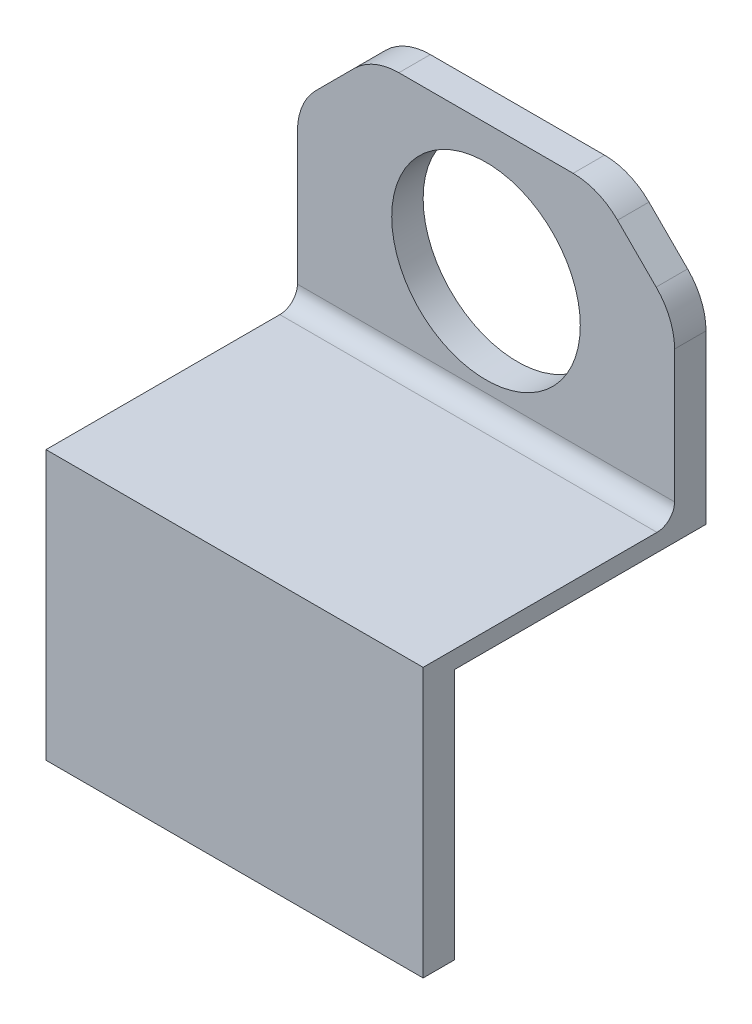
ISO-10303-21;
HEADER;
FILE_DESCRIPTION(('STEP AP214'),'2;1');
FILE_NAME('part.step','',(''),(''),'','','');
FILE_SCHEMA(('AUTOMOTIVE_DESIGN { 1 0 10303 214 1 1 1 1 }'));
ENDSEC;
DATA;
#1=APPLICATION_CONTEXT('core data for automotive mechanical design processes');
#2=APPLICATION_PROTOCOL_DEFINITION('international standard','automotive_design',2000,#1);
#3=PRODUCT_CONTEXT('',#1,'mechanical');
#4=PRODUCT('Part','Part','',(#3));
#5=PRODUCT_RELATED_PRODUCT_CATEGORY('part','',(#4));
#6=PRODUCT_DEFINITION_FORMATION('','',#4);
#7=PRODUCT_DEFINITION_CONTEXT('part definition',#1,'design');
#8=PRODUCT_DEFINITION('design','',#6,#7);
#9=PRODUCT_DEFINITION_SHAPE('','',#8);
#10=(LENGTH_UNIT() NAMED_UNIT(*) SI_UNIT(.MILLI.,.METRE.));
#11=(NAMED_UNIT(*) PLANE_ANGLE_UNIT() SI_UNIT($,.RADIAN.));
#12=(NAMED_UNIT(*) SI_UNIT($,.STERADIAN.) SOLID_ANGLE_UNIT());
#13=UNCERTAINTY_MEASURE_WITH_UNIT(LENGTH_MEASURE(1.E-05),#10,'distance_accuracy_value','');
#14=(GEOMETRIC_REPRESENTATION_CONTEXT(3) GLOBAL_UNCERTAINTY_ASSIGNED_CONTEXT((#13)) GLOBAL_UNIT_ASSIGNED_CONTEXT((#10,
#11,#12)) REPRESENTATION_CONTEXT('',''));
#15=CARTESIAN_POINT('',(0.,0.,0.));
#16=DIRECTION('',(0.,0.,1.));
#17=DIRECTION('',(1.,0.,0.));
#18=AXIS2_PLACEMENT_3D('',#15,#16,#17);
#19=CARTESIAN_POINT('',(0.,14.478,0.));
#20=DIRECTION('',(0.,-1.,0.));
#21=DIRECTION('',(0.,0.,-1.));
#22=AXIS2_PLACEMENT_3D('',#19,#20,#21);
#23=PLANE('',#22);
#24=DIRECTION('',(0.,0.,-1.));
#25=VECTOR('',#24,1.);
#26=CARTESIAN_POINT('',(19.05,14.478,1.5875));
#27=LINE('',#26,#25);
#28=CARTESIAN_POINT('',(19.05,14.478,1.5875));
#29=VERTEX_POINT('',#28);
#30=CARTESIAN_POINT('',(19.05,14.478,-22.0345));
#31=VERTEX_POINT('',#30);
#32=EDGE_CURVE('E160',#29,#31,#27,.T.);
#33=ORIENTED_EDGE('',*,*,#32,.T.);
#34=DIRECTION('',(1.,0.,0.));
#35=VECTOR('',#34,1.);
#36=CARTESIAN_POINT('',(-19.05,14.478,-22.0345));
#37=LINE('',#36,#35);
#38=CARTESIAN_POINT('',(-19.05,14.478,-22.0345));
#39=VERTEX_POINT('',#38);
#40=EDGE_CURVE('E56',#31,#39,#37,.F.);
#41=ORIENTED_EDGE('',*,*,#40,.T.);
#42=DIRECTION('',(0.,0.,1.));
#43=VECTOR('',#42,1.);
#44=CARTESIAN_POINT('',(-19.05,14.478,1.5875));
#45=LINE('',#44,#43);
#46=CARTESIAN_POINT('',(-19.05,14.478,1.5875));
#47=VERTEX_POINT('',#46);
#48=EDGE_CURVE('E139',#39,#47,#45,.T.);
#49=ORIENTED_EDGE('',*,*,#48,.T.);
#50=DIRECTION('',(1.,0.,0.));
#51=VECTOR('',#50,1.);
#52=CARTESIAN_POINT('',(-19.05,14.478,1.5875));
#53=LINE('',#52,#51);
#54=EDGE_CURVE('E142',#47,#29,#53,.T.);
#55=ORIENTED_EDGE('',*,*,#54,.T.);
#56=EDGE_LOOP('',(#33,#41,#49,#55));
#57=FACE_BOUND('',#56,.T.);
#58=ADVANCED_FACE('F35',(#57),#23,.F.);
#59=CARTESIAN_POINT('',(19.05,12.7,1.5875));
#60=DIRECTION('',(-1.,0.,0.));
#61=DIRECTION('',(0.,0.,1.));
#62=AXIS2_PLACEMENT_3D('',#59,#60,#61);
#63=PLANE('',#62);
#64=DIRECTION('',(0.,-1.,0.));
#65=VECTOR('',#64,1.);
#66=CARTESIAN_POINT('',(19.05,14.478,-26.9875));
#67=LINE('',#66,#65);
#68=CARTESIAN_POINT('',(19.05,29.6277438789308,-26.9875));
#69=VERTEX_POINT('',#68);
#70=CARTESIAN_POINT('',(19.05,12.7,-26.9875));
#71=VERTEX_POINT('',#70);
#72=EDGE_CURVE('E222',#69,#71,#67,.T.);
#73=ORIENTED_EDGE('',*,*,#72,.F.);
#74=DIRECTION('',(0.,0.,-1.));
#75=VECTOR('',#74,1.);
#76=CARTESIAN_POINT('',(19.05,29.6277438789308,-23.8125));
#77=LINE('',#76,#75);
#78=CARTESIAN_POINT('',(19.05,29.6277438789308,-23.8125));
#79=VERTEX_POINT('',#78);
#80=EDGE_CURVE('E202',#69,#79,#77,.F.);
#81=ORIENTED_EDGE('',*,*,#80,.T.);
#82=DIRECTION('',(0.,-1.,0.));
#83=VECTOR('',#82,1.);
#84=CARTESIAN_POINT('',(19.05,39.878,-23.8125));
#85=LINE('',#84,#83);
#86=CARTESIAN_POINT('',(19.05,16.256,-23.8125));
#87=VERTEX_POINT('',#86);
#88=EDGE_CURVE('E181',#79,#87,#85,.T.);
#89=ORIENTED_EDGE('',*,*,#88,.T.);
#90=CARTESIAN_POINT('',(19.05,16.256,-22.0345));
#91=DIRECTION('',(-1.,0.,0.));
#92=DIRECTION('',(0.,0.,1.));
#93=AXIS2_PLACEMENT_3D('',#90,#91,#92);
#94=CIRCLE('',#93,1.778);
#95=EDGE_CURVE('E43',#87,#31,#94,.T.);
#96=ORIENTED_EDGE('',*,*,#95,.T.);
#97=ORIENTED_EDGE('',*,*,#32,.F.);
#98=DIRECTION('',(0.,1.,0.));
#99=VECTOR('',#98,1.);
#100=CARTESIAN_POINT('',(19.05,12.7,1.5875));
#101=LINE('',#100,#99);
#102=CARTESIAN_POINT('',(19.05,-12.7,1.5875));
#103=VERTEX_POINT('',#102);
#104=EDGE_CURVE('E156',#103,#29,#101,.T.);
#105=ORIENTED_EDGE('',*,*,#104,.F.);
#106=DIRECTION('',(0.,0.,-1.));
#107=VECTOR('',#106,1.);
#108=CARTESIAN_POINT('',(19.05,-12.7,1.5875));
#109=LINE('',#108,#107);
#110=CARTESIAN_POINT('',(19.05,-12.7,-1.5875));
#111=VERTEX_POINT('',#110);
#112=EDGE_CURVE('E241',#103,#111,#109,.T.);
#113=ORIENTED_EDGE('',*,*,#112,.T.);
#114=DIRECTION('',(0.,1.,0.));
#115=VECTOR('',#114,1.);
#116=CARTESIAN_POINT('',(19.05,12.7,-1.5875));
#117=LINE('',#116,#115);
#118=CARTESIAN_POINT('',(19.05,12.7,-1.5875));
#119=VERTEX_POINT('',#118);
#120=EDGE_CURVE('E279',#111,#119,#117,.T.);
#121=ORIENTED_EDGE('',*,*,#120,.T.);
#122=DIRECTION('',(0.,0.,-1.));
#123=VECTOR('',#122,1.);
#124=CARTESIAN_POINT('',(19.05,12.7,1.5875));
#125=LINE('',#124,#123);
#126=EDGE_CURVE('E284',#119,#71,#125,.T.);
#127=ORIENTED_EDGE('',*,*,#126,.T.);
#128=EDGE_LOOP('',(#73,#81,#89,#96,#97,#105,#113,#121,#127));
#129=FACE_BOUND('',#128,.T.);
#130=ADVANCED_FACE('F219',(#129),#63,.F.);
#131=CARTESIAN_POINT('',(-19.05,12.7,1.5875));
#132=DIRECTION('',(1.,0.,0.));
#133=DIRECTION('',(0.,0.,-1.));
#134=AXIS2_PLACEMENT_3D('',#131,#132,#133);
#135=PLANE('',#134);
#136=DIRECTION('',(0.,-1.,0.));
#137=VECTOR('',#136,1.);
#138=CARTESIAN_POINT('',(-19.05,39.878,-23.8125));
#139=LINE('',#138,#137);
#140=CARTESIAN_POINT('',(-19.05,29.6277438789308,-23.8125));
#141=VERTEX_POINT('',#140);
#142=CARTESIAN_POINT('',(-19.05,16.256,-23.8125));
#143=VERTEX_POINT('',#142);
#144=EDGE_CURVE('E184',#141,#143,#139,.T.);
#145=ORIENTED_EDGE('',*,*,#144,.F.);
#146=DIRECTION('',(0.,0.,1.));
#147=VECTOR('',#146,1.);
#148=CARTESIAN_POINT('',(-19.05,29.6277438789308,-26.9875));
#149=LINE('',#148,#147);
#150=CARTESIAN_POINT('',(-19.05,29.6277438789308,-26.9875));
#151=VERTEX_POINT('',#150);
#152=EDGE_CURVE('E248',#141,#151,#149,.F.);
#153=ORIENTED_EDGE('',*,*,#152,.T.);
#154=DIRECTION('',(0.,-1.,0.));
#155=VECTOR('',#154,1.);
#156=CARTESIAN_POINT('',(-19.05,14.478,-26.9875));
#157=LINE('',#156,#155);
#158=CARTESIAN_POINT('',(-19.05,12.7,-26.9875));
#159=VERTEX_POINT('',#158);
#160=EDGE_CURVE('E162',#151,#159,#157,.T.);
#161=ORIENTED_EDGE('',*,*,#160,.T.);
#162=DIRECTION('',(0.,0.,1.));
#163=VECTOR('',#162,1.);
#164=CARTESIAN_POINT('',(-19.05,12.7,1.5875));
#165=LINE('',#164,#163);
#166=CARTESIAN_POINT('',(-19.05,12.7,-1.5875));
#167=VERTEX_POINT('',#166);
#168=EDGE_CURVE('E250',#159,#167,#165,.T.);
#169=ORIENTED_EDGE('',*,*,#168,.T.);
#170=DIRECTION('',(0.,-1.,0.));
#171=VECTOR('',#170,1.);
#172=CARTESIAN_POINT('',(-19.05,12.7,-1.5875));
#173=LINE('',#172,#171);
#174=CARTESIAN_POINT('',(-19.05,-12.7,-1.5875));
#175=VERTEX_POINT('',#174);
#176=EDGE_CURVE('E297',#167,#175,#173,.T.);
#177=ORIENTED_EDGE('',*,*,#176,.T.);
#178=DIRECTION('',(0.,0.,-1.));
#179=VECTOR('',#178,1.);
#180=CARTESIAN_POINT('',(-19.05,-12.7,1.5875));
#181=LINE('',#180,#179);
#182=CARTESIAN_POINT('',(-19.05,-12.7,1.5875));
#183=VERTEX_POINT('',#182);
#184=EDGE_CURVE('E152',#183,#175,#181,.T.);
#185=ORIENTED_EDGE('',*,*,#184,.F.);
#186=DIRECTION('',(0.,-1.,0.));
#187=VECTOR('',#186,1.);
#188=CARTESIAN_POINT('',(-19.05,12.7,1.5875));
#189=LINE('',#188,#187);
#190=EDGE_CURVE('E148',#47,#183,#189,.T.);
#191=ORIENTED_EDGE('',*,*,#190,.F.);
#192=ORIENTED_EDGE('',*,*,#48,.F.);
#193=CARTESIAN_POINT('',(-19.05,16.256,-22.0345));
#194=DIRECTION('',(1.,0.,0.));
#195=DIRECTION('',(0.,0.,-1.));
#196=AXIS2_PLACEMENT_3D('',#193,#194,#195);
#197=CIRCLE('',#196,1.778);
#198=EDGE_CURVE('E11',#39,#143,#197,.T.);
#199=ORIENTED_EDGE('',*,*,#198,.T.);
#200=EDGE_LOOP('',(#145,#153,#161,#169,#177,#185,#191,#192,#199));
#201=FACE_BOUND('',#200,.T.);
#202=ADVANCED_FACE('F150',(#201),#135,.F.);
#203=CARTESIAN_POINT('',(-19.05,-12.7,1.5875));
#204=DIRECTION('',(0.,1.,0.));
#205=DIRECTION('',(0.,0.,1.));
#206=AXIS2_PLACEMENT_3D('',#203,#204,#205);
#207=PLANE('',#206);
#208=DIRECTION('',(1.,0.,0.));
#209=VECTOR('',#208,1.);
#210=CARTESIAN_POINT('',(-19.05,-12.7,-1.5875));
#211=LINE('',#210,#209);
#212=EDGE_CURVE('E287',#175,#111,#211,.T.);
#213=ORIENTED_EDGE('',*,*,#212,.T.);
#214=ORIENTED_EDGE('',*,*,#112,.F.);
#215=DIRECTION('',(1.,0.,0.));
#216=VECTOR('',#215,1.);
#217=CARTESIAN_POINT('',(-19.05,-12.7,1.5875));
#218=LINE('',#217,#216);
#219=EDGE_CURVE('E155',#183,#103,#218,.T.);
#220=ORIENTED_EDGE('',*,*,#219,.F.);
#221=ORIENTED_EDGE('',*,*,#184,.T.);
#222=EDGE_LOOP('',(#213,#214,#220,#221));
#223=FACE_BOUND('',#222,.T.);
#224=ADVANCED_FACE('F310',(#223),#207,.F.);
#225=CARTESIAN_POINT('',(0.,0.,1.5875));
#226=DIRECTION('',(0.,0.,1.));
#227=DIRECTION('',(1.,0.,0.));
#228=AXIS2_PLACEMENT_3D('',#225,#226,#227);
#229=PLANE('',#228);
#230=ORIENTED_EDGE('',*,*,#104,.T.);
#231=ORIENTED_EDGE('',*,*,#54,.F.);
#232=ORIENTED_EDGE('',*,*,#190,.T.);
#233=ORIENTED_EDGE('',*,*,#219,.T.);
#234=EDGE_LOOP('',(#230,#231,#232,#233));
#235=FACE_BOUND('',#234,.T.);
#236=ADVANCED_FACE('F158',(#235),#229,.T.);
#237=CARTESIAN_POINT('',(0.,0.,-1.5875));
#238=DIRECTION('',(0.,0.,1.));
#239=DIRECTION('',(1.,0.,0.));
#240=AXIS2_PLACEMENT_3D('',#237,#238,#239);
#241=PLANE('',#240);
#242=ORIENTED_EDGE('',*,*,#120,.F.);
#243=ORIENTED_EDGE('',*,*,#212,.F.);
#244=ORIENTED_EDGE('',*,*,#176,.F.);
#245=DIRECTION('',(-1.,0.,0.));
#246=VECTOR('',#245,1.);
#247=CARTESIAN_POINT('',(-19.05,12.7,-1.5875));
#248=LINE('',#247,#246);
#249=EDGE_CURVE('E294',#119,#167,#248,.T.);
#250=ORIENTED_EDGE('',*,*,#249,.F.);
#251=EDGE_LOOP('',(#242,#243,#244,#250));
#252=FACE_BOUND('',#251,.T.);
#253=ADVANCED_FACE('F311',(#252),#241,.F.);
#254=CARTESIAN_POINT('',(-19.05,14.478,-26.9875));
#255=DIRECTION('',(0.,0.,1.));
#256=DIRECTION('',(1.,0.,0.));
#257=AXIS2_PLACEMENT_3D('',#254,#255,#256);
#258=PLANE('',#257);
#259=CARTESIAN_POINT('',(0.,26.924,-26.9875));
#260=DIRECTION('',(0.,0.,1.));
#261=DIRECTION('',(1.,0.,0.));
#262=AXIS2_PLACEMENT_3D('',#259,#260,#261);
#263=CIRCLE('',#262,9.525);
#264=CARTESIAN_POINT('',(9.525,26.924,-26.9875));
#265=VERTEX_POINT('',#264);
#266=EDGE_CURVE('E346',#265,#265,#263,.T.);
#267=ORIENTED_EDGE('',*,*,#266,.T.);
#268=EDGE_LOOP('',(#267));
#269=FACE_BOUND('',#268,.T.);
#270=ORIENTED_EDGE('',*,*,#160,.F.);
#271=CARTESIAN_POINT('',(-12.7,29.6277438789308,-26.9875));
#272=DIRECTION('',(0.,0.,1.));
#273=DIRECTION('',(1.,0.,0.));
#274=AXIS2_PLACEMENT_3D('',#271,#272,#273);
#275=CIRCLE('',#274,6.35);
#276=CARTESIAN_POINT('',(-17.1901280605346,34.1178719394654,-26.9875));
#277=VERTEX_POINT('',#276);
#278=EDGE_CURVE('E258',#151,#277,#275,.F.);
#279=ORIENTED_EDGE('',*,*,#278,.T.);
#280=DIRECTION('',(-0.707106781186546,-0.707106781186549,0.));
#281=VECTOR('',#280,1.);
#282=CARTESIAN_POINT('',(-11.43,39.878,-26.9875));
#283=LINE('',#282,#281);
#284=CARTESIAN_POINT('',(-13.2898719394654,38.0181280605346,-26.9875));
#285=VERTEX_POINT('',#284);
#286=EDGE_CURVE('E245',#277,#285,#283,.F.);
#287=ORIENTED_EDGE('',*,*,#286,.T.);
#288=CARTESIAN_POINT('',(-8.79974387893083,33.528,-26.9875));
#289=DIRECTION('',(0.,0.,1.));
#290=DIRECTION('',(1.,0.,0.));
#291=AXIS2_PLACEMENT_3D('',#288,#289,#290);
#292=CIRCLE('',#291,6.35);
#293=CARTESIAN_POINT('',(-8.79974387893083,39.878,-26.9875));
#294=VERTEX_POINT('',#293);
#295=EDGE_CURVE('E256',#285,#294,#292,.F.);
#296=ORIENTED_EDGE('',*,*,#295,.T.);
#297=DIRECTION('',(-1.,0.,0.));
#298=VECTOR('',#297,1.);
#299=CARTESIAN_POINT('',(19.05,39.878,-26.9875));
#300=LINE('',#299,#298);
#301=CARTESIAN_POINT('',(8.79974387893085,39.878,-26.9875));
#302=VERTEX_POINT('',#301);
#303=EDGE_CURVE('E349',#302,#294,#300,.T.);
#304=ORIENTED_EDGE('',*,*,#303,.F.);
#305=CARTESIAN_POINT('',(8.79974387893085,33.528,-26.9875));
#306=DIRECTION('',(0.,0.,1.));
#307=DIRECTION('',(1.,0.,0.));
#308=AXIS2_PLACEMENT_3D('',#305,#306,#307);
#309=CIRCLE('',#308,6.35);
#310=CARTESIAN_POINT('',(13.2898719394654,38.0181280605346,-26.9875));
#311=VERTEX_POINT('',#310);
#312=EDGE_CURVE('E253',#302,#311,#309,.F.);
#313=ORIENTED_EDGE('',*,*,#312,.T.);
#314=DIRECTION('',(-0.707106781186546,0.707106781186549,0.));
#315=VECTOR('',#314,1.);
#316=CARTESIAN_POINT('',(11.43,39.878,-26.9875));
#317=LINE('',#316,#315);
#318=CARTESIAN_POINT('',(17.1901280605346,34.1178719394654,-26.9875));
#319=VERTEX_POINT('',#318);
#320=EDGE_CURVE('E239',#311,#319,#317,.F.);
#321=ORIENTED_EDGE('',*,*,#320,.T.);
#322=CARTESIAN_POINT('',(12.7,29.6277438789308,-26.9875));
#323=DIRECTION('',(0.,0.,1.));
#324=DIRECTION('',(1.,0.,0.));
#325=AXIS2_PLACEMENT_3D('',#322,#323,#324);
#326=CIRCLE('',#325,6.35);
#327=EDGE_CURVE('E227',#319,#69,#326,.F.);
#328=ORIENTED_EDGE('',*,*,#327,.T.);
#329=ORIENTED_EDGE('',*,*,#72,.T.);
#330=DIRECTION('',(-1.,0.,0.));
#331=VECTOR('',#330,1.);
#332=CARTESIAN_POINT('',(-19.05,12.7,-26.9875));
#333=LINE('',#332,#331);
#334=EDGE_CURVE('E145',#71,#159,#333,.T.);
#335=ORIENTED_EDGE('',*,*,#334,.T.);
#336=EDGE_LOOP('',(#270,#279,#287,#296,#304,#313,#321,#328,#329,#335));
#337=FACE_BOUND('',#336,.T.);
#338=ADVANCED_FACE('F275',(#269,#337),#258,.F.);
#339=CARTESIAN_POINT('',(0.,12.7,0.));
#340=DIRECTION('',(0.,-1.,0.));
#341=DIRECTION('',(0.,0.,-1.));
#342=AXIS2_PLACEMENT_3D('',#339,#340,#341);
#343=PLANE('',#342);
#344=ORIENTED_EDGE('',*,*,#126,.F.);
#345=ORIENTED_EDGE('',*,*,#249,.T.);
#346=ORIENTED_EDGE('',*,*,#168,.F.);
#347=ORIENTED_EDGE('',*,*,#334,.F.);
#348=EDGE_LOOP('',(#344,#345,#346,#347));
#349=FACE_BOUND('',#348,.T.);
#350=ADVANCED_FACE('F308',(#349),#343,.T.);
#351=CARTESIAN_POINT('',(19.05,39.878,-23.8125));
#352=DIRECTION('',(0.,0.,-1.));
#353=DIRECTION('',(-1.,0.,0.));
#354=AXIS2_PLACEMENT_3D('',#351,#352,#353);
#355=PLANE('',#354);
#356=CARTESIAN_POINT('',(0.,26.924,-23.8125));
#357=DIRECTION('',(0.,0.,1.));
#358=DIRECTION('',(1.,0.,0.));
#359=AXIS2_PLACEMENT_3D('',#356,#357,#358);
#360=CIRCLE('',#359,9.525);
#361=CARTESIAN_POINT('',(9.525,26.924,-23.8125));
#362=VERTEX_POINT('',#361);
#363=EDGE_CURVE('E344',#362,#362,#360,.T.);
#364=ORIENTED_EDGE('',*,*,#363,.F.);
#365=EDGE_LOOP('',(#364));
#366=FACE_BOUND('',#365,.T.);
#367=ORIENTED_EDGE('',*,*,#144,.T.);
#368=DIRECTION('',(1.,0.,0.));
#369=VECTOR('',#368,1.);
#370=CARTESIAN_POINT('',(19.05,16.256,-23.8125));
#371=LINE('',#370,#369);
#372=EDGE_CURVE('E209',#143,#87,#371,.T.);
#373=ORIENTED_EDGE('',*,*,#372,.T.);
#374=ORIENTED_EDGE('',*,*,#88,.F.);
#375=CARTESIAN_POINT('',(12.7,29.6277438789308,-23.8125));
#376=DIRECTION('',(0.,0.,-1.));
#377=DIRECTION('',(-1.,0.,0.));
#378=AXIS2_PLACEMENT_3D('',#375,#376,#377);
#379=CIRCLE('',#378,6.35);
#380=CARTESIAN_POINT('',(17.1901280605346,34.1178719394654,-23.8125));
#381=VERTEX_POINT('',#380);
#382=EDGE_CURVE('E190',#79,#381,#379,.F.);
#383=ORIENTED_EDGE('',*,*,#382,.T.);
#384=DIRECTION('',(0.707106781186546,-0.707106781186549,0.));
#385=VECTOR('',#384,1.);
#386=CARTESIAN_POINT('',(11.43,39.878,-23.8125));
#387=LINE('',#386,#385);
#388=CARTESIAN_POINT('',(13.2898719394654,38.0181280605346,-23.8125));
#389=VERTEX_POINT('',#388);
#390=EDGE_CURVE('E230',#381,#389,#387,.F.);
#391=ORIENTED_EDGE('',*,*,#390,.T.);
#392=CARTESIAN_POINT('',(8.79974387893085,33.528,-23.8125));
#393=DIRECTION('',(0.,0.,-1.));
#394=DIRECTION('',(-1.,0.,0.));
#395=AXIS2_PLACEMENT_3D('',#392,#393,#394);
#396=CIRCLE('',#395,6.35);
#397=CARTESIAN_POINT('',(8.79974387893085,39.878,-23.8125));
#398=VERTEX_POINT('',#397);
#399=EDGE_CURVE('E188',#389,#398,#396,.F.);
#400=ORIENTED_EDGE('',*,*,#399,.T.);
#401=DIRECTION('',(1.,0.,0.));
#402=VECTOR('',#401,1.);
#403=CARTESIAN_POINT('',(19.05,39.878,-23.8125));
#404=LINE('',#403,#402);
#405=CARTESIAN_POINT('',(-8.79974387893083,39.878,-23.8125));
#406=VERTEX_POINT('',#405);
#407=EDGE_CURVE('E185',#406,#398,#404,.T.);
#408=ORIENTED_EDGE('',*,*,#407,.F.);
#409=CARTESIAN_POINT('',(-8.79974387893083,33.528,-23.8125));
#410=DIRECTION('',(0.,0.,-1.));
#411=DIRECTION('',(-1.,0.,0.));
#412=AXIS2_PLACEMENT_3D('',#409,#410,#411);
#413=CIRCLE('',#412,6.35);
#414=CARTESIAN_POINT('',(-13.2898719394654,38.0181280605346,-23.8125));
#415=VERTEX_POINT('',#414);
#416=EDGE_CURVE('E192',#406,#415,#413,.F.);
#417=ORIENTED_EDGE('',*,*,#416,.T.);
#418=DIRECTION('',(0.707106781186546,0.707106781186549,0.));
#419=VECTOR('',#418,1.);
#420=CARTESIAN_POINT('',(-11.43,39.878,-23.8125));
#421=LINE('',#420,#419);
#422=CARTESIAN_POINT('',(-17.1901280605346,34.1178719394654,-23.8125));
#423=VERTEX_POINT('',#422);
#424=EDGE_CURVE('E237',#415,#423,#421,.F.);
#425=ORIENTED_EDGE('',*,*,#424,.T.);
#426=CARTESIAN_POINT('',(-12.7,29.6277438789308,-23.8125));
#427=DIRECTION('',(0.,0.,-1.));
#428=DIRECTION('',(-1.,0.,0.));
#429=AXIS2_PLACEMENT_3D('',#426,#427,#428);
#430=CIRCLE('',#429,6.35);
#431=EDGE_CURVE('E194',#423,#141,#430,.F.);
#432=ORIENTED_EDGE('',*,*,#431,.T.);
#433=EDGE_LOOP('',(#367,#373,#374,#383,#391,#400,#408,#417,#425,#432));
#434=FACE_BOUND('',#433,.T.);
#435=ADVANCED_FACE('F216',(#366,#434),#355,.F.);
#436=CARTESIAN_POINT('',(0.,39.878,0.));
#437=DIRECTION('',(0.,-1.,0.));
#438=DIRECTION('',(0.,0.,-1.));
#439=AXIS2_PLACEMENT_3D('',#436,#437,#438);
#440=PLANE('',#439);
#441=ORIENTED_EDGE('',*,*,#303,.T.);
#442=DIRECTION('',(0.,0.,-1.));
#443=VECTOR('',#442,1.);
#444=CARTESIAN_POINT('',(-8.79974387893083,39.878,-23.8125));
#445=LINE('',#444,#443);
#446=EDGE_CURVE('E199',#294,#406,#445,.F.);
#447=ORIENTED_EDGE('',*,*,#446,.T.);
#448=ORIENTED_EDGE('',*,*,#407,.T.);
#449=DIRECTION('',(0.,0.,1.));
#450=VECTOR('',#449,1.);
#451=CARTESIAN_POINT('',(8.79974387893085,39.878,-26.9875));
#452=LINE('',#451,#450);
#453=EDGE_CURVE('E196',#398,#302,#452,.F.);
#454=ORIENTED_EDGE('',*,*,#453,.T.);
#455=EDGE_LOOP('',(#441,#447,#448,#454));
#456=FACE_BOUND('',#455,.T.);
#457=ADVANCED_FACE('F335',(#456),#440,.F.);
#458=CARTESIAN_POINT('',(0.,26.924,-26.987525));
#459=DIRECTION('',(0.,0.,1.));
#460=DIRECTION('',(1.,0.,0.));
#461=AXIS2_PLACEMENT_3D('',#458,#459,#460);
#462=CYLINDRICAL_SURFACE('',#461,9.525);
#463=ORIENTED_EDGE('',*,*,#363,.T.);
#464=EDGE_LOOP('',(#463));
#465=FACE_BOUND('',#464,.T.);
#466=ORIENTED_EDGE('',*,*,#266,.F.);
#467=EDGE_LOOP('',(#466));
#468=FACE_BOUND('',#467,.T.);
#469=ADVANCED_FACE('F340',(#465,#468),#462,.F.);
#470=CARTESIAN_POINT('',(-11.43,39.878,0.));
#471=DIRECTION('',(0.707106781186549,-0.707106781186546,0.));
#472=DIRECTION('',(0.,0.,1.));
#473=AXIS2_PLACEMENT_3D('',#470,#471,#472);
#474=PLANE('',#473);
#475=ORIENTED_EDGE('',*,*,#286,.F.);
#476=DIRECTION('',(0.,0.,-1.));
#477=VECTOR('',#476,1.);
#478=CARTESIAN_POINT('',(-17.1901280605346,34.1178719394654,-23.8125));
#479=LINE('',#478,#477);
#480=EDGE_CURVE('E186',#277,#423,#479,.F.);
#481=ORIENTED_EDGE('',*,*,#480,.T.);
#482=ORIENTED_EDGE('',*,*,#424,.F.);
#483=DIRECTION('',(0.,0.,1.));
#484=VECTOR('',#483,1.);
#485=CARTESIAN_POINT('',(-13.2898719394654,38.0181280605346,-26.9875));
#486=LINE('',#485,#484);
#487=EDGE_CURVE('E259',#415,#285,#486,.F.);
#488=ORIENTED_EDGE('',*,*,#487,.T.);
#489=EDGE_LOOP('',(#475,#481,#482,#488));
#490=FACE_BOUND('',#489,.T.);
#491=ADVANCED_FACE('F265',(#490),#474,.F.);
#492=CARTESIAN_POINT('',(11.43,39.878,0.));
#493=DIRECTION('',(-0.707106781186549,-0.707106781186546,0.));
#494=DIRECTION('',(0.,0.,-1.));
#495=AXIS2_PLACEMENT_3D('',#492,#493,#494);
#496=PLANE('',#495);
#497=ORIENTED_EDGE('',*,*,#390,.F.);
#498=DIRECTION('',(0.,0.,1.));
#499=VECTOR('',#498,1.);
#500=CARTESIAN_POINT('',(17.1901280605346,34.1178719394654,-26.9875));
#501=LINE('',#500,#499);
#502=EDGE_CURVE('E207',#381,#319,#501,.F.);
#503=ORIENTED_EDGE('',*,*,#502,.T.);
#504=ORIENTED_EDGE('',*,*,#320,.F.);
#505=DIRECTION('',(0.,0.,-1.));
#506=VECTOR('',#505,1.);
#507=CARTESIAN_POINT('',(13.2898719394654,38.0181280605346,-23.8125));
#508=LINE('',#507,#506);
#509=EDGE_CURVE('E205',#311,#389,#508,.F.);
#510=ORIENTED_EDGE('',*,*,#509,.T.);
#511=EDGE_LOOP('',(#497,#503,#504,#510));
#512=FACE_BOUND('',#511,.T.);
#513=ADVANCED_FACE('F233',(#512),#496,.F.);
#514=CARTESIAN_POINT('',(-12.7,29.6277438789308,1.5875));
#515=DIRECTION('',(0.,0.,-1.));
#516=DIRECTION('',(-1.,0.,0.));
#517=AXIS2_PLACEMENT_3D('',#514,#515,#516);
#518=CYLINDRICAL_SURFACE('',#517,6.35);
#519=ORIENTED_EDGE('',*,*,#431,.F.);
#520=ORIENTED_EDGE('',*,*,#480,.F.);
#521=ORIENTED_EDGE('',*,*,#278,.F.);
#522=ORIENTED_EDGE('',*,*,#152,.F.);
#523=EDGE_LOOP('',(#519,#520,#521,#522));
#524=FACE_BOUND('',#523,.T.);
#525=ADVANCED_FACE('F270',(#524),#518,.T.);
#526=CARTESIAN_POINT('',(-8.79974387893083,33.528,0.));
#527=DIRECTION('',(0.,0.,1.));
#528=DIRECTION('',(1.,0.,0.));
#529=AXIS2_PLACEMENT_3D('',#526,#527,#528);
#530=CYLINDRICAL_SURFACE('',#529,6.35);
#531=ORIENTED_EDGE('',*,*,#295,.F.);
#532=ORIENTED_EDGE('',*,*,#487,.F.);
#533=ORIENTED_EDGE('',*,*,#416,.F.);
#534=ORIENTED_EDGE('',*,*,#446,.F.);
#535=EDGE_LOOP('',(#531,#532,#533,#534));
#536=FACE_BOUND('',#535,.T.);
#537=ADVANCED_FACE('F361',(#536),#530,.T.);
#538=CARTESIAN_POINT('',(12.7,29.6277438789308,1.5875));
#539=DIRECTION('',(0.,0.,1.));
#540=DIRECTION('',(1.,0.,0.));
#541=AXIS2_PLACEMENT_3D('',#538,#539,#540);
#542=CYLINDRICAL_SURFACE('',#541,6.35);
#543=ORIENTED_EDGE('',*,*,#327,.F.);
#544=ORIENTED_EDGE('',*,*,#502,.F.);
#545=ORIENTED_EDGE('',*,*,#382,.F.);
#546=ORIENTED_EDGE('',*,*,#80,.F.);
#547=EDGE_LOOP('',(#543,#544,#545,#546));
#548=FACE_BOUND('',#547,.T.);
#549=ADVANCED_FACE('F225',(#548),#542,.T.);
#550=CARTESIAN_POINT('',(8.79974387893085,33.528,0.));
#551=DIRECTION('',(0.,0.,-1.));
#552=DIRECTION('',(-1.,0.,0.));
#553=AXIS2_PLACEMENT_3D('',#550,#551,#552);
#554=CYLINDRICAL_SURFACE('',#553,6.35);
#555=ORIENTED_EDGE('',*,*,#399,.F.);
#556=ORIENTED_EDGE('',*,*,#509,.F.);
#557=ORIENTED_EDGE('',*,*,#312,.F.);
#558=ORIENTED_EDGE('',*,*,#453,.F.);
#559=EDGE_LOOP('',(#555,#556,#557,#558));
#560=FACE_BOUND('',#559,.T.);
#561=ADVANCED_FACE('F358',(#560),#554,.T.);
#562=CARTESIAN_POINT('',(19.05,16.256,-22.0345));
#563=DIRECTION('',(-1.,0.,0.));
#564=DIRECTION('',(0.,0.,1.));
#565=AXIS2_PLACEMENT_3D('',#562,#563,#564);
#566=CYLINDRICAL_SURFACE('',#565,1.778);
#567=ORIENTED_EDGE('',*,*,#198,.F.);
#568=ORIENTED_EDGE('',*,*,#40,.F.);
#569=ORIENTED_EDGE('',*,*,#95,.F.);
#570=ORIENTED_EDGE('',*,*,#372,.F.);
#571=EDGE_LOOP('',(#567,#568,#569,#570));
#572=FACE_BOUND('',#571,.T.);
#573=ADVANCED_FACE('F37',(#572),#566,.F.);
#574=CLOSED_SHELL('',(#58,#130,#202,#224,#236,#253,#338,#350,#435,#457,#469,#491,#513,#525,#537,
#549,#561,#573));
#575=MANIFOLD_SOLID_BREP('B2',#574);
#576=ADVANCED_BREP_SHAPE_REPRESENTATION('',(#18,#575),#14);
#577=SHAPE_DEFINITION_REPRESENTATION(#9,#576);
ENDSEC;
END-ISO-10303-21;
